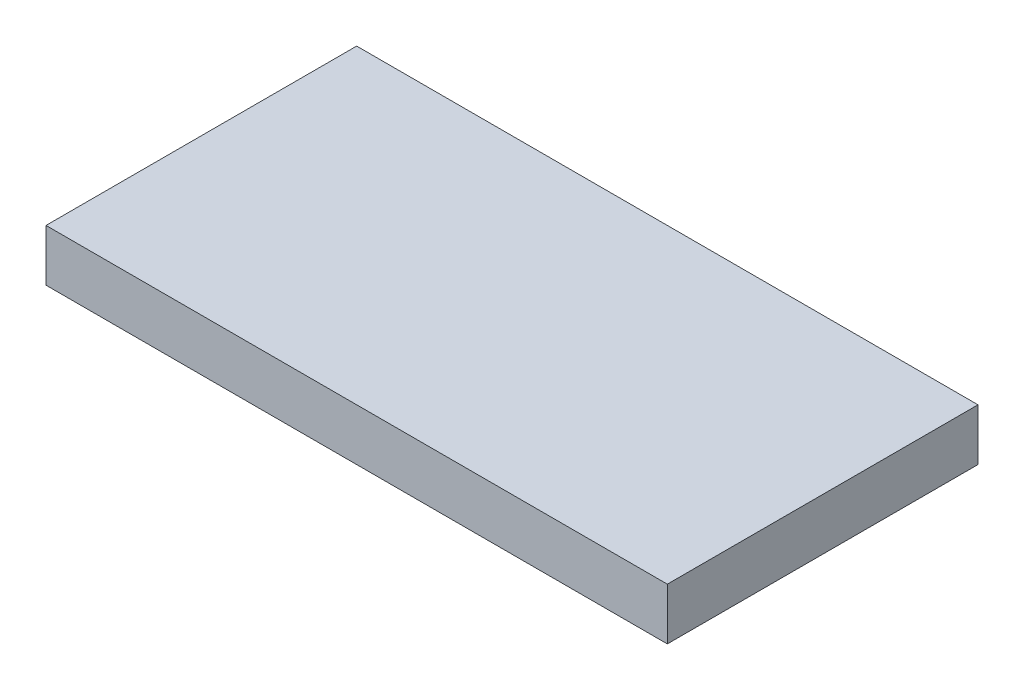
ISO-10303-21;
HEADER;
FILE_DESCRIPTION(('STEP AP214'),'2;1');
FILE_NAME('part.step','',(''),(''),'','','');
FILE_SCHEMA(('AUTOMOTIVE_DESIGN { 1 0 10303 214 1 1 1 1 }'));
ENDSEC;
DATA;
#1=APPLICATION_CONTEXT('core data for automotive mechanical design processes');
#2=APPLICATION_PROTOCOL_DEFINITION('international standard','automotive_design',2000,#1);
#3=PRODUCT_CONTEXT('',#1,'mechanical');
#4=PRODUCT('Part','Part','',(#3));
#5=PRODUCT_RELATED_PRODUCT_CATEGORY('part','',(#4));
#6=PRODUCT_DEFINITION_FORMATION('','',#4);
#7=PRODUCT_DEFINITION_CONTEXT('part definition',#1,'design');
#8=PRODUCT_DEFINITION('design','',#6,#7);
#9=PRODUCT_DEFINITION_SHAPE('','',#8);
#10=(LENGTH_UNIT() NAMED_UNIT(*) SI_UNIT(.MILLI.,.METRE.));
#11=(NAMED_UNIT(*) PLANE_ANGLE_UNIT() SI_UNIT($,.RADIAN.));
#12=(NAMED_UNIT(*) SI_UNIT($,.STERADIAN.) SOLID_ANGLE_UNIT());
#13=UNCERTAINTY_MEASURE_WITH_UNIT(LENGTH_MEASURE(1.E-05),#10,'distance_accuracy_value','');
#14=(GEOMETRIC_REPRESENTATION_CONTEXT(3) GLOBAL_UNCERTAINTY_ASSIGNED_CONTEXT((#13)) GLOBAL_UNIT_ASSIGNED_CONTEXT((#10,
#11,#12)) REPRESENTATION_CONTEXT('',''));
#15=CARTESIAN_POINT('',(0.,0.,0.));
#16=DIRECTION('',(0.,0.,1.));
#17=DIRECTION('',(1.,0.,0.));
#18=AXIS2_PLACEMENT_3D('',#15,#16,#17);
#19=CARTESIAN_POINT('',(30.,2.5,15.));
#20=DIRECTION('',(-1.,0.,0.));
#21=DIRECTION('',(0.,0.,1.));
#22=AXIS2_PLACEMENT_3D('',#19,#20,#21);
#23=PLANE('',#22);
#24=DIRECTION('',(0.,0.,-1.));
#25=VECTOR('',#24,1.);
#26=CARTESIAN_POINT('',(30.,-2.5,15.));
#27=LINE('',#26,#25);
#28=CARTESIAN_POINT('',(30.,-2.5,15.));
#29=VERTEX_POINT('',#28);
#30=CARTESIAN_POINT('',(30.,-2.5,-15.));
#31=VERTEX_POINT('',#30);
#32=EDGE_CURVE('E97',#29,#31,#27,.T.);
#33=ORIENTED_EDGE('',*,*,#32,.T.);
#34=DIRECTION('',(0.,-1.,0.));
#35=VECTOR('',#34,1.);
#36=CARTESIAN_POINT('',(30.,2.5,-15.));
#37=LINE('',#36,#35);
#38=CARTESIAN_POINT('',(30.,2.5,-15.));
#39=VERTEX_POINT('',#38);
#40=EDGE_CURVE('E11',#39,#31,#37,.T.);
#41=ORIENTED_EDGE('',*,*,#40,.F.);
#42=DIRECTION('',(0.,0.,-1.));
#43=VECTOR('',#42,1.);
#44=CARTESIAN_POINT('',(30.,2.5,15.));
#45=LINE('',#44,#43);
#46=CARTESIAN_POINT('',(30.,2.5,15.));
#47=VERTEX_POINT('',#46);
#48=EDGE_CURVE('E85',#47,#39,#45,.T.);
#49=ORIENTED_EDGE('',*,*,#48,.F.);
#50=DIRECTION('',(0.,-1.,0.));
#51=VECTOR('',#50,1.);
#52=CARTESIAN_POINT('',(30.,2.5,15.));
#53=LINE('',#52,#51);
#54=EDGE_CURVE('E93',#47,#29,#53,.T.);
#55=ORIENTED_EDGE('',*,*,#54,.T.);
#56=EDGE_LOOP('',(#33,#41,#49,#55));
#57=FACE_BOUND('',#56,.T.);
#58=ADVANCED_FACE('F34',(#57),#23,.F.);
#59=CARTESIAN_POINT('',(-30.,2.5,-15.));
#60=DIRECTION('',(0.,0.,1.));
#61=DIRECTION('',(1.,0.,0.));
#62=AXIS2_PLACEMENT_3D('',#59,#60,#61);
#63=PLANE('',#62);
#64=DIRECTION('',(-1.,0.,0.));
#65=VECTOR('',#64,1.);
#66=CARTESIAN_POINT('',(-30.,-2.5,-15.));
#67=LINE('',#66,#65);
#68=CARTESIAN_POINT('',(-30.,-2.5,-15.));
#69=VERTEX_POINT('',#68);
#70=EDGE_CURVE('E89',#31,#69,#67,.T.);
#71=ORIENTED_EDGE('',*,*,#70,.T.);
#72=DIRECTION('',(0.,-1.,0.));
#73=VECTOR('',#72,1.);
#74=CARTESIAN_POINT('',(-30.,2.5,-15.));
#75=LINE('',#74,#73);
#76=CARTESIAN_POINT('',(-30.,2.5,-15.));
#77=VERTEX_POINT('',#76);
#78=EDGE_CURVE('E42',#77,#69,#75,.T.);
#79=ORIENTED_EDGE('',*,*,#78,.F.);
#80=DIRECTION('',(-1.,0.,0.));
#81=VECTOR('',#80,1.);
#82=CARTESIAN_POINT('',(-30.,2.5,-15.));
#83=LINE('',#82,#81);
#84=EDGE_CURVE('E80',#39,#77,#83,.T.);
#85=ORIENTED_EDGE('',*,*,#84,.F.);
#86=ORIENTED_EDGE('',*,*,#40,.T.);
#87=EDGE_LOOP('',(#71,#79,#85,#86));
#88=FACE_BOUND('',#87,.T.);
#89=ADVANCED_FACE('F88',(#88),#63,.F.);
#90=CARTESIAN_POINT('',(-30.,2.5,15.));
#91=DIRECTION('',(1.,0.,0.));
#92=DIRECTION('',(0.,0.,-1.));
#93=AXIS2_PLACEMENT_3D('',#90,#91,#92);
#94=PLANE('',#93);
#95=DIRECTION('',(0.,0.,1.));
#96=VECTOR('',#95,1.);
#97=CARTESIAN_POINT('',(-30.,-2.5,15.));
#98=LINE('',#97,#96);
#99=CARTESIAN_POINT('',(-30.,-2.5,15.));
#100=VERTEX_POINT('',#99);
#101=EDGE_CURVE('E67',#69,#100,#98,.T.);
#102=ORIENTED_EDGE('',*,*,#101,.T.);
#103=DIRECTION('',(0.,-1.,0.));
#104=VECTOR('',#103,1.);
#105=CARTESIAN_POINT('',(-30.,2.5,15.));
#106=LINE('',#105,#104);
#107=CARTESIAN_POINT('',(-30.,2.5,15.));
#108=VERTEX_POINT('',#107);
#109=EDGE_CURVE('E90',#108,#100,#106,.T.);
#110=ORIENTED_EDGE('',*,*,#109,.F.);
#111=DIRECTION('',(0.,0.,1.));
#112=VECTOR('',#111,1.);
#113=CARTESIAN_POINT('',(-30.,2.5,15.));
#114=LINE('',#113,#112);
#115=EDGE_CURVE('E83',#77,#108,#114,.T.);
#116=ORIENTED_EDGE('',*,*,#115,.F.);
#117=ORIENTED_EDGE('',*,*,#78,.T.);
#118=EDGE_LOOP('',(#102,#110,#116,#117));
#119=FACE_BOUND('',#118,.T.);
#120=ADVANCED_FACE('F91',(#119),#94,.F.);
#121=CARTESIAN_POINT('',(-30.,2.5,15.));
#122=DIRECTION('',(0.,0.,-1.));
#123=DIRECTION('',(-1.,0.,0.));
#124=AXIS2_PLACEMENT_3D('',#121,#122,#123);
#125=PLANE('',#124);
#126=DIRECTION('',(1.,0.,0.));
#127=VECTOR('',#126,1.);
#128=CARTESIAN_POINT('',(-30.,-2.5,15.));
#129=LINE('',#128,#127);
#130=EDGE_CURVE('E73',#100,#29,#129,.T.);
#131=ORIENTED_EDGE('',*,*,#130,.T.);
#132=ORIENTED_EDGE('',*,*,#54,.F.);
#133=DIRECTION('',(1.,0.,0.));
#134=VECTOR('',#133,1.);
#135=CARTESIAN_POINT('',(-30.,2.5,15.));
#136=LINE('',#135,#134);
#137=EDGE_CURVE('E50',#108,#47,#136,.T.);
#138=ORIENTED_EDGE('',*,*,#137,.F.);
#139=ORIENTED_EDGE('',*,*,#109,.T.);
#140=EDGE_LOOP('',(#131,#132,#138,#139));
#141=FACE_BOUND('',#140,.T.);
#142=ADVANCED_FACE('F104',(#141),#125,.F.);
#143=CARTESIAN_POINT('',(0.,2.5,0.));
#144=DIRECTION('',(0.,-1.,0.));
#145=DIRECTION('',(0.,0.,-1.));
#146=AXIS2_PLACEMENT_3D('',#143,#144,#145);
#147=PLANE('',#146);
#148=ORIENTED_EDGE('',*,*,#48,.T.);
#149=ORIENTED_EDGE('',*,*,#84,.T.);
#150=ORIENTED_EDGE('',*,*,#115,.T.);
#151=ORIENTED_EDGE('',*,*,#137,.T.);
#152=EDGE_LOOP('',(#148,#149,#150,#151));
#153=FACE_BOUND('',#152,.T.);
#154=ADVANCED_FACE('F81',(#153),#147,.F.);
#155=CARTESIAN_POINT('',(0.,-2.5,0.));
#156=DIRECTION('',(0.,-1.,0.));
#157=DIRECTION('',(0.,0.,-1.));
#158=AXIS2_PLACEMENT_3D('',#155,#156,#157);
#159=PLANE('',#158);
#160=ORIENTED_EDGE('',*,*,#32,.F.);
#161=ORIENTED_EDGE('',*,*,#130,.F.);
#162=ORIENTED_EDGE('',*,*,#101,.F.);
#163=ORIENTED_EDGE('',*,*,#70,.F.);
#164=EDGE_LOOP('',(#160,#161,#162,#163));
#165=FACE_BOUND('',#164,.T.);
#166=ADVANCED_FACE('F107',(#165),#159,.T.);
#167=CLOSED_SHELL('',(#58,#89,#120,#142,#154,#166));
#168=MANIFOLD_SOLID_BREP('B2',#167);
#169=ADVANCED_BREP_SHAPE_REPRESENTATION('',(#18,#168),#14);
#170=SHAPE_DEFINITION_REPRESENTATION(#9,#169);
ENDSEC;
END-ISO-10303-21;
